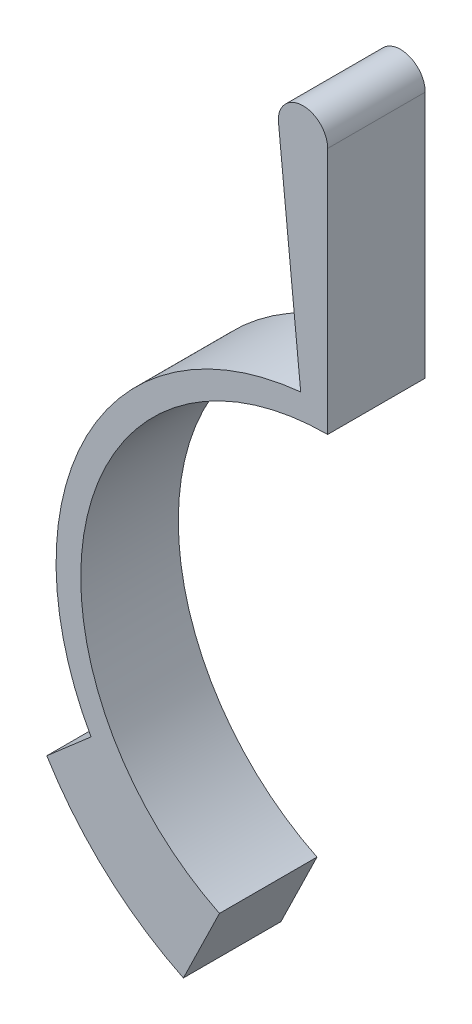
ISO-10303-21;
HEADER;
FILE_DESCRIPTION(('STEP AP214'),'2;1');
FILE_NAME('part.step','',(''),(''),'','','');
FILE_SCHEMA(('AUTOMOTIVE_DESIGN { 1 0 10303 214 1 1 1 1 }'));
ENDSEC;
DATA;
#1=APPLICATION_CONTEXT('core data for automotive mechanical design processes');
#2=APPLICATION_PROTOCOL_DEFINITION('international standard','automotive_design',2000,#1);
#3=PRODUCT_CONTEXT('',#1,'mechanical');
#4=PRODUCT('Part','Part','',(#3));
#5=PRODUCT_RELATED_PRODUCT_CATEGORY('part','',(#4));
#6=PRODUCT_DEFINITION_FORMATION('','',#4);
#7=PRODUCT_DEFINITION_CONTEXT('part definition',#1,'design');
#8=PRODUCT_DEFINITION('design','',#6,#7);
#9=PRODUCT_DEFINITION_SHAPE('','',#8);
#10=(LENGTH_UNIT() NAMED_UNIT(*) SI_UNIT(.MILLI.,.METRE.));
#11=(NAMED_UNIT(*) PLANE_ANGLE_UNIT() SI_UNIT($,.RADIAN.));
#12=(NAMED_UNIT(*) SI_UNIT($,.STERADIAN.) SOLID_ANGLE_UNIT());
#13=UNCERTAINTY_MEASURE_WITH_UNIT(LENGTH_MEASURE(1.E-05),#10,'distance_accuracy_value','');
#14=(GEOMETRIC_REPRESENTATION_CONTEXT(3) GLOBAL_UNCERTAINTY_ASSIGNED_CONTEXT((#13)) GLOBAL_UNIT_ASSIGNED_CONTEXT((#10,
#11,#12)) REPRESENTATION_CONTEXT('',''));
#15=CARTESIAN_POINT('',(0.,0.,0.));
#16=DIRECTION('',(0.,0.,1.));
#17=DIRECTION('',(1.,0.,0.));
#18=AXIS2_PLACEMENT_3D('',#15,#16,#17);
#19=CARTESIAN_POINT('',(11.4998134890954,-13.2193353915043,8.07952961915133));
#20=DIRECTION('',(-0.656332722816929,0.754471574653224,0.));
#21=DIRECTION('',(-0.754471574653224,-0.65633272281693,0.));
#22=AXIS2_PLACEMENT_3D('',#19,#20,#21);
#23=PLANE('',#22);
#24=DIRECTION('',(0.754471574653224,0.656332722816929,0.));
#25=VECTOR('',#24,1.);
#26=CARTESIAN_POINT('',(11.4998134890954,-13.2193353915043,0.));
#27=LINE('',#26,#25);
#28=CARTESIAN_POINT('',(-21.588669402968,-42.0037916918111,0.));
#29=VERTEX_POINT('',#28);
#30=CARTESIAN_POINT('',(-17.9258098249803,-38.8173832426635,0.));
#31=VERTEX_POINT('',#30);
#32=EDGE_CURVE('E130',#29,#31,#27,.T.);
#33=ORIENTED_EDGE('',*,*,#32,.F.);
#34=DIRECTION('',(0.,0.,-1.));
#35=VECTOR('',#34,1.);
#36=CARTESIAN_POINT('',(-21.588669402968,-42.0037916918111,8.07952961915133));
#37=LINE('',#36,#35);
#38=CARTESIAN_POINT('',(-21.588669402968,-42.0037916918111,8.07952961915133));
#39=VERTEX_POINT('',#38);
#40=EDGE_CURVE('E11',#39,#29,#37,.T.);
#41=ORIENTED_EDGE('',*,*,#40,.F.);
#42=DIRECTION('',(0.754471574653224,0.656332722816929,0.));
#43=VECTOR('',#42,1.);
#44=CARTESIAN_POINT('',(11.4998134890954,-13.2193353915043,8.07952961915133));
#45=LINE('',#44,#43);
#46=CARTESIAN_POINT('',(-17.9258098249803,-38.8173832426635,8.07952961915133));
#47=VERTEX_POINT('',#46);
#48=EDGE_CURVE('E148',#39,#47,#45,.T.);
#49=ORIENTED_EDGE('',*,*,#48,.T.);
#50=DIRECTION('',(0.,0.,-1.));
#51=VECTOR('',#50,1.);
#52=CARTESIAN_POINT('',(-17.9258098249803,-38.8173832426635,8.07952961915133));
#53=LINE('',#52,#51);
#54=EDGE_CURVE('E85',#47,#31,#53,.T.);
#55=ORIENTED_EDGE('',*,*,#54,.T.);
#56=EDGE_LOOP('',(#33,#41,#49,#55));
#57=FACE_BOUND('',#56,.T.);
#58=ADVANCED_FACE('F35',(#57),#23,.T.);
#59=CARTESIAN_POINT('',(1.67875922247521,-27.7760575766238,8.07952961915133));
#60=DIRECTION('',(0.,0.,-1.));
#61=DIRECTION('',(-1.,0.,0.));
#62=AXIS2_PLACEMENT_3D('',#59,#60,#61);
#63=CYLINDRICAL_SURFACE('',#62,27.2727272727275);
#64=CARTESIAN_POINT('',(1.67875922247521,-27.7760575766238,0.));
#65=DIRECTION('',(0.,0.,1.));
#66=DIRECTION('',(1.,0.,0.));
#67=AXIS2_PLACEMENT_3D('',#64,#65,#66);
#68=CIRCLE('',#67,27.2727272727275);
#69=CARTESIAN_POINT('',(-10.2739003735643,-52.2900450424317,0.));
#70=VERTEX_POINT('',#69);
#71=EDGE_CURVE('E133',#29,#70,#68,.T.);
#72=ORIENTED_EDGE('',*,*,#71,.T.);
#73=DIRECTION('',(0.,0.,-1.));
#74=VECTOR('',#73,1.);
#75=CARTESIAN_POINT('',(-10.2739003735643,-52.2900450424317,8.07952961915133));
#76=LINE('',#75,#74);
#77=CARTESIAN_POINT('',(-10.2739003735643,-52.2900450424317,8.07952961915133));
#78=VERTEX_POINT('',#77);
#79=EDGE_CURVE('E43',#78,#70,#76,.T.);
#80=ORIENTED_EDGE('',*,*,#79,.F.);
#81=CARTESIAN_POINT('',(1.67875922247521,-27.7760575766238,8.07952961915133));
#82=DIRECTION('',(0.,0.,1.));
#83=DIRECTION('',(1.,0.,0.));
#84=AXIS2_PLACEMENT_3D('',#81,#82,#83);
#85=CIRCLE('',#84,27.2727272727275);
#86=EDGE_CURVE('E174',#39,#78,#85,.T.);
#87=ORIENTED_EDGE('',*,*,#86,.F.);
#88=ORIENTED_EDGE('',*,*,#40,.T.);
#89=EDGE_LOOP('',(#72,#80,#87,#88));
#90=FACE_BOUND('',#89,.T.);
#91=ADVANCED_FACE('F178',(#90),#63,.T.);
#92=CARTESIAN_POINT('',(12.2981914184232,-5.99641718330716,8.07952961915133));
#93=DIRECTION('',(-0.898846207079611,0.438264185188109,0.));
#94=DIRECTION('',(-0.438264185188109,-0.898846207079611,0.));
#95=AXIS2_PLACEMENT_3D('',#92,#93,#94);
#96=PLANE('',#95);
#97=DIRECTION('',(0.438264185188109,0.898846207079611,0.));
#98=VECTOR('',#97,1.);
#99=CARTESIAN_POINT('',(12.2981914184232,-5.99641718330716,0.));
#100=LINE('',#99,#98);
#101=CARTESIAN_POINT('',(-7.28573547455429,-46.1615481759795,0.));
#102=VERTEX_POINT('',#101);
#103=EDGE_CURVE('E135',#70,#102,#100,.T.);
#104=ORIENTED_EDGE('',*,*,#103,.T.);
#105=DIRECTION('',(0.,0.,-1.));
#106=VECTOR('',#105,1.);
#107=CARTESIAN_POINT('',(-7.28573547455429,-46.1615481759795,8.07952961915133));
#108=LINE('',#107,#106);
#109=CARTESIAN_POINT('',(-7.28573547455429,-46.1615481759795,8.07952961915133));
#110=VERTEX_POINT('',#109);
#111=EDGE_CURVE('E154',#110,#102,#108,.T.);
#112=ORIENTED_EDGE('',*,*,#111,.F.);
#113=DIRECTION('',(0.438264185188109,0.898846207079611,0.));
#114=VECTOR('',#113,1.);
#115=CARTESIAN_POINT('',(12.2981914184232,-5.99641718330716,8.07952961915133));
#116=LINE('',#115,#114);
#117=EDGE_CURVE('E162',#78,#110,#116,.T.);
#118=ORIENTED_EDGE('',*,*,#117,.F.);
#119=ORIENTED_EDGE('',*,*,#79,.T.);
#120=EDGE_LOOP('',(#104,#112,#118,#119));
#121=FACE_BOUND('',#120,.T.);
#122=ADVANCED_FACE('F160',(#121),#96,.F.);
#123=CARTESIAN_POINT('',(1.67875922247521,-27.7760575766238,8.07952961915133));
#124=DIRECTION('',(0.,0.,-1.));
#125=DIRECTION('',(-1.,0.,0.));
#126=AXIS2_PLACEMENT_3D('',#123,#124,#125);
#127=CYLINDRICAL_SURFACE('',#126,20.4545454545455);
#128=CARTESIAN_POINT('',(1.67875922247521,-27.7760575766238,0.));
#129=DIRECTION('',(0.,0.,1.));
#130=DIRECTION('',(1.,0.,0.));
#131=AXIS2_PLACEMENT_3D('',#128,#129,#130);
#132=CIRCLE('',#131,20.4545454545455);
#133=CARTESIAN_POINT('',(1.67875922247521,-7.32151212207834,0.));
#134=VERTEX_POINT('',#133);
#135=EDGE_CURVE('E138',#134,#102,#132,.T.);
#136=ORIENTED_EDGE('',*,*,#135,.F.);
#137=DIRECTION('',(0.,0.,-1.));
#138=VECTOR('',#137,1.);
#139=CARTESIAN_POINT('',(1.67875922247521,-7.32151212207834,8.07952961915133));
#140=LINE('',#139,#138);
#141=CARTESIAN_POINT('',(1.67875922247521,-7.32151212207834,8.07952961915133));
#142=VERTEX_POINT('',#141);
#143=EDGE_CURVE('E152',#142,#134,#140,.T.);
#144=ORIENTED_EDGE('',*,*,#143,.F.);
#145=CARTESIAN_POINT('',(1.67875922247521,-27.7760575766238,8.07952961915133));
#146=DIRECTION('',(0.,0.,1.));
#147=DIRECTION('',(1.,0.,0.));
#148=AXIS2_PLACEMENT_3D('',#145,#146,#147);
#149=CIRCLE('',#148,20.4545454545455);
#150=EDGE_CURVE('E172',#142,#110,#149,.T.);
#151=ORIENTED_EDGE('',*,*,#150,.T.);
#152=ORIENTED_EDGE('',*,*,#111,.T.);
#153=EDGE_LOOP('',(#136,#144,#151,#152));
#154=FACE_BOUND('',#153,.T.);
#155=ADVANCED_FACE('F170',(#154),#127,.F.);
#156=CARTESIAN_POINT('',(1.67875922247501,0.,8.07952961915133));
#157=DIRECTION('',(-1.,0.,0.));
#158=DIRECTION('',(0.,-1.,0.));
#159=AXIS2_PLACEMENT_3D('',#156,#157,#158);
#160=PLANE('',#159);
#161=DIRECTION('',(0.,1.,0.));
#162=VECTOR('',#161,1.);
#163=CARTESIAN_POINT('',(1.67875922247501,0.,0.));
#164=LINE('',#163,#162);
#165=CARTESIAN_POINT('',(1.67875922247502,13.2005134532266,0.));
#166=VERTEX_POINT('',#165);
#167=EDGE_CURVE('E141',#134,#166,#164,.T.);
#168=ORIENTED_EDGE('',*,*,#167,.T.);
#169=DIRECTION('',(0.,0.,-1.));
#170=VECTOR('',#169,1.);
#171=CARTESIAN_POINT('',(1.67875922247502,13.2005134532266,8.07952961915133));
#172=LINE('',#171,#170);
#173=CARTESIAN_POINT('',(1.67875922247502,13.2005134532266,8.07952961915133));
#174=VERTEX_POINT('',#173);
#175=EDGE_CURVE('E123',#174,#166,#172,.T.);
#176=ORIENTED_EDGE('',*,*,#175,.F.);
#177=DIRECTION('',(0.,1.,0.));
#178=VECTOR('',#177,1.);
#179=CARTESIAN_POINT('',(1.67875922247501,0.,8.07952961915133));
#180=LINE('',#179,#178);
#181=EDGE_CURVE('E110',#142,#174,#180,.T.);
#182=ORIENTED_EDGE('',*,*,#181,.F.);
#183=ORIENTED_EDGE('',*,*,#143,.T.);
#184=EDGE_LOOP('',(#168,#176,#182,#183));
#185=FACE_BOUND('',#184,.T.);
#186=ADVANCED_FACE('F188',(#185),#160,.F.);
#187=CARTESIAN_POINT('',(-0.366695322979521,13.2005134532266,8.07952961915133));
#188=DIRECTION('',(0.,0.,-1.));
#189=DIRECTION('',(-1.,0.,0.));
#190=AXIS2_PLACEMENT_3D('',#187,#188,#189);
#191=CYLINDRICAL_SURFACE('',#190,2.04545454545438);
#192=CARTESIAN_POINT('',(-0.366695322979521,13.2005134532266,0.));
#193=DIRECTION('',(0.,0.,1.));
#194=DIRECTION('',(1.,0.,0.));
#195=AXIS2_PLACEMENT_3D('',#192,#193,#194);
#196=CIRCLE('',#195,2.04545454545438);
#197=CARTESIAN_POINT('',(-2.41214986843407,13.2005134532266,0.));
#198=VERTEX_POINT('',#197);
#199=EDGE_CURVE('E119',#166,#198,#196,.T.);
#200=ORIENTED_EDGE('',*,*,#199,.T.);
#201=DIRECTION('',(0.,0.,-1.));
#202=VECTOR('',#201,1.);
#203=CARTESIAN_POINT('',(-2.41214986843407,13.2005134532266,8.07952961915133));
#204=LINE('',#203,#202);
#205=CARTESIAN_POINT('',(-2.41214986843407,13.2005134532266,8.07952961915133));
#206=VERTEX_POINT('',#205);
#207=EDGE_CURVE('E116',#206,#198,#204,.T.);
#208=ORIENTED_EDGE('',*,*,#207,.F.);
#209=CARTESIAN_POINT('',(-0.366695322979521,13.2005134532266,8.07952961915133));
#210=DIRECTION('',(0.,0.,1.));
#211=DIRECTION('',(1.,0.,0.));
#212=AXIS2_PLACEMENT_3D('',#209,#210,#211);
#213=CIRCLE('',#212,2.04545454545438);
#214=EDGE_CURVE('E103',#174,#206,#213,.T.);
#215=ORIENTED_EDGE('',*,*,#214,.F.);
#216=ORIENTED_EDGE('',*,*,#175,.T.);
#217=EDGE_LOOP('',(#200,#208,#215,#216));
#218=FACE_BOUND('',#217,.T.);
#219=ADVANCED_FACE('F117',(#218),#191,.T.);
#220=CARTESIAN_POINT('',(-1.08347330337214,-0.108168904208354,8.07952961915133));
#221=DIRECTION('',(-0.995053401256278,-0.0993414749654592,0.));
#222=DIRECTION('',(0.0993414749654592,-0.995053401256278,0.));
#223=AXIS2_PLACEMENT_3D('',#220,#221,#222);
#224=PLANE('',#223);
#225=DIRECTION('',(-0.0993414749654592,0.995053401256278,0.));
#226=VECTOR('',#225,1.);
#227=CARTESIAN_POINT('',(-1.08347330337214,-0.108168904208354,0.));
#228=LINE('',#227,#226);
#229=CARTESIAN_POINT('',(-0.556423964254809,-5.38735604835863,0.));
#230=VERTEX_POINT('',#229);
#231=EDGE_CURVE('E144',#230,#198,#228,.T.);
#232=ORIENTED_EDGE('',*,*,#231,.F.);
#233=DIRECTION('',(0.,0.,-1.));
#234=VECTOR('',#233,1.);
#235=CARTESIAN_POINT('',(-0.556423964254809,-5.38735604835863,8.07952961915133));
#236=LINE('',#235,#234);
#237=CARTESIAN_POINT('',(-0.556423964254809,-5.38735604835863,8.07952961915133));
#238=VERTEX_POINT('',#237);
#239=EDGE_CURVE('E78',#238,#230,#236,.T.);
#240=ORIENTED_EDGE('',*,*,#239,.F.);
#241=DIRECTION('',(-0.0993414749654592,0.995053401256278,0.));
#242=VECTOR('',#241,1.);
#243=CARTESIAN_POINT('',(-1.08347330337214,-0.108168904208354,8.07952961915133));
#244=LINE('',#243,#242);
#245=EDGE_CURVE('E107',#238,#206,#244,.T.);
#246=ORIENTED_EDGE('',*,*,#245,.T.);
#247=ORIENTED_EDGE('',*,*,#207,.T.);
#248=EDGE_LOOP('',(#232,#240,#246,#247));
#249=FACE_BOUND('',#248,.T.);
#250=ADVANCED_FACE('F125',(#249),#224,.T.);
#251=CARTESIAN_POINT('',(1.67875922247521,-27.7760575766238,8.07952961915133));
#252=DIRECTION('',(0.,0.,-1.));
#253=DIRECTION('',(-1.,0.,0.));
#254=AXIS2_PLACEMENT_3D('',#251,#252,#253);
#255=CYLINDRICAL_SURFACE('',#254,22.4999999999998);
#256=CARTESIAN_POINT('',(1.67875922247521,-27.7760575766238,0.));
#257=DIRECTION('',(0.,0.,1.));
#258=DIRECTION('',(1.,0.,0.));
#259=AXIS2_PLACEMENT_3D('',#256,#257,#258);
#260=CIRCLE('',#259,22.4999999999998);
#261=EDGE_CURVE('E146',#230,#31,#260,.T.);
#262=ORIENTED_EDGE('',*,*,#261,.T.);
#263=ORIENTED_EDGE('',*,*,#54,.F.);
#264=CARTESIAN_POINT('',(1.67875922247521,-27.7760575766238,8.07952961915133));
#265=DIRECTION('',(0.,0.,1.));
#266=DIRECTION('',(1.,0.,0.));
#267=AXIS2_PLACEMENT_3D('',#264,#265,#266);
#268=CIRCLE('',#267,22.4999999999998);
#269=EDGE_CURVE('E51',#238,#47,#268,.T.);
#270=ORIENTED_EDGE('',*,*,#269,.F.);
#271=ORIENTED_EDGE('',*,*,#239,.T.);
#272=EDGE_LOOP('',(#262,#263,#270,#271));
#273=FACE_BOUND('',#272,.T.);
#274=ADVANCED_FACE('F196',(#273),#255,.T.);
#275=CARTESIAN_POINT('',(0.,0.,8.07952961915133));
#276=DIRECTION('',(0.,0.,1.));
#277=DIRECTION('',(1.,0.,0.));
#278=AXIS2_PLACEMENT_3D('',#275,#276,#277);
#279=PLANE('',#278);
#280=ORIENTED_EDGE('',*,*,#48,.F.);
#281=ORIENTED_EDGE('',*,*,#86,.T.);
#282=ORIENTED_EDGE('',*,*,#117,.T.);
#283=ORIENTED_EDGE('',*,*,#150,.F.);
#284=ORIENTED_EDGE('',*,*,#181,.T.);
#285=ORIENTED_EDGE('',*,*,#214,.T.);
#286=ORIENTED_EDGE('',*,*,#245,.F.);
#287=ORIENTED_EDGE('',*,*,#269,.T.);
#288=EDGE_LOOP('',(#280,#281,#282,#283,#284,#285,#286,#287));
#289=FACE_BOUND('',#288,.T.);
#290=ADVANCED_FACE('F105',(#289),#279,.T.);
#291=CARTESIAN_POINT('',(0.,0.,0.));
#292=DIRECTION('',(0.,0.,1.));
#293=DIRECTION('',(1.,0.,0.));
#294=AXIS2_PLACEMENT_3D('',#291,#292,#293);
#295=PLANE('',#294);
#296=ORIENTED_EDGE('',*,*,#32,.T.);
#297=ORIENTED_EDGE('',*,*,#261,.F.);
#298=ORIENTED_EDGE('',*,*,#231,.T.);
#299=ORIENTED_EDGE('',*,*,#199,.F.);
#300=ORIENTED_EDGE('',*,*,#167,.F.);
#301=ORIENTED_EDGE('',*,*,#135,.T.);
#302=ORIENTED_EDGE('',*,*,#103,.F.);
#303=ORIENTED_EDGE('',*,*,#71,.F.);
#304=EDGE_LOOP('',(#296,#297,#298,#299,#300,#301,#302,#303));
#305=FACE_BOUND('',#304,.T.);
#306=ADVANCED_FACE('F166',(#305),#295,.F.);
#307=CLOSED_SHELL('',(#58,#91,#122,#155,#186,#219,#250,#274,#290,#306));
#308=MANIFOLD_SOLID_BREP('B2',#307);
#309=ADVANCED_BREP_SHAPE_REPRESENTATION('',(#18,#308),#14);
#310=SHAPE_DEFINITION_REPRESENTATION(#9,#309);
ENDSEC;
END-ISO-10303-21;
